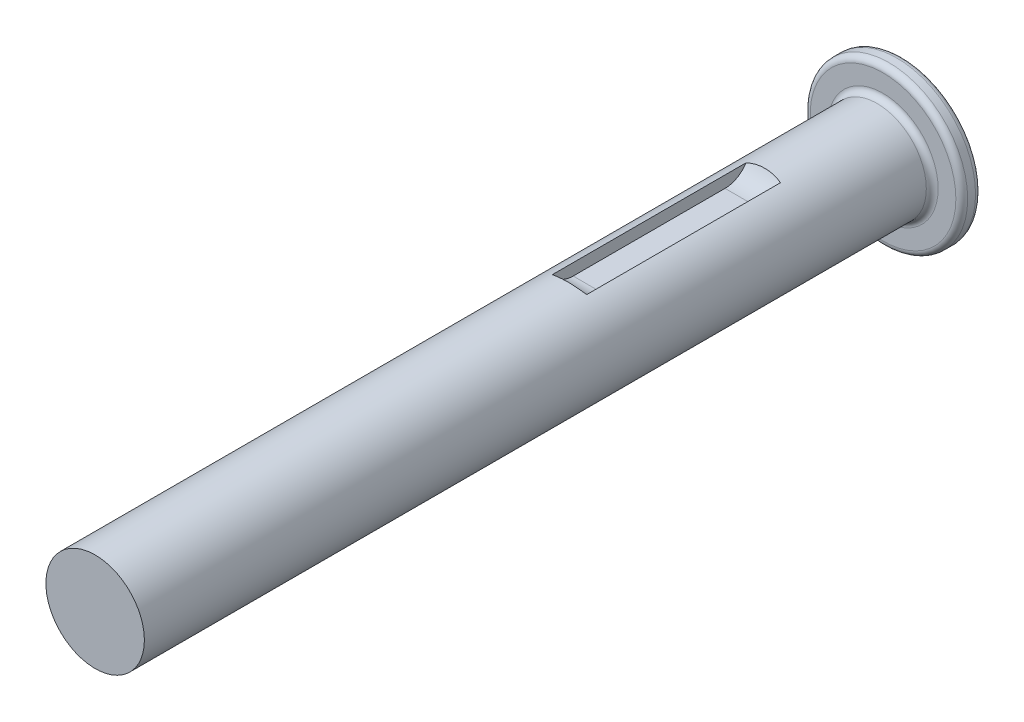
ISO-10303-21;
HEADER;
FILE_DESCRIPTION(('STEP AP214'),'2;1');
FILE_NAME('part.step','',(''),(''),'','','');
FILE_SCHEMA(('AUTOMOTIVE_DESIGN { 1 0 10303 214 1 1 1 1 }'));
ENDSEC;
DATA;
#1=APPLICATION_CONTEXT('core data for automotive mechanical design processes');
#2=APPLICATION_PROTOCOL_DEFINITION('international standard','automotive_design',2000,#1);
#3=PRODUCT_CONTEXT('',#1,'mechanical');
#4=PRODUCT('Part','Part','',(#3));
#5=PRODUCT_RELATED_PRODUCT_CATEGORY('part','',(#4));
#6=PRODUCT_DEFINITION_FORMATION('','',#4);
#7=PRODUCT_DEFINITION_CONTEXT('part definition',#1,'design');
#8=PRODUCT_DEFINITION('design','',#6,#7);
#9=PRODUCT_DEFINITION_SHAPE('','',#8);
#10=(LENGTH_UNIT() NAMED_UNIT(*) SI_UNIT(.MILLI.,.METRE.));
#11=(NAMED_UNIT(*) PLANE_ANGLE_UNIT() SI_UNIT($,.RADIAN.));
#12=(NAMED_UNIT(*) SI_UNIT($,.STERADIAN.) SOLID_ANGLE_UNIT());
#13=UNCERTAINTY_MEASURE_WITH_UNIT(LENGTH_MEASURE(1.E-05),#10,'distance_accuracy_value','');
#14=(GEOMETRIC_REPRESENTATION_CONTEXT(3) GLOBAL_UNCERTAINTY_ASSIGNED_CONTEXT((#13)) GLOBAL_UNIT_ASSIGNED_CONTEXT((#10,
#11,#12)) REPRESENTATION_CONTEXT('',''));
#15=CARTESIAN_POINT('',(0.,0.,0.));
#16=DIRECTION('',(0.,0.,1.));
#17=DIRECTION('',(1.,0.,0.));
#18=AXIS2_PLACEMENT_3D('',#15,#16,#17);
#19=CARTESIAN_POINT('',(0.,0.,2.));
#20=DIRECTION('',(0.,0.,-1.));
#21=DIRECTION('',(-1.,0.,0.));
#22=AXIS2_PLACEMENT_3D('',#19,#20,#21);
#23=CYLINDRICAL_SURFACE('',#22,8.);
#24=CARTESIAN_POINT('',(0.,0.,0.6));
#25=DIRECTION('',(0.,0.,1.));
#26=DIRECTION('',(1.,0.,0.));
#27=AXIS2_PLACEMENT_3D('',#24,#25,#26);
#28=CIRCLE('',#27,8.);
#29=CARTESIAN_POINT('',(8.,0.,0.6));
#30=VERTEX_POINT('',#29);
#31=EDGE_CURVE('E198',#30,#30,#28,.T.);
#32=ORIENTED_EDGE('',*,*,#31,.T.);
#33=EDGE_LOOP('',(#32));
#34=FACE_BOUND('',#33,.T.);
#35=CARTESIAN_POINT('',(0.,0.,1.4));
#36=DIRECTION('',(0.,0.,1.));
#37=DIRECTION('',(1.,0.,0.));
#38=AXIS2_PLACEMENT_3D('',#35,#36,#37);
#39=CIRCLE('',#38,8.);
#40=CARTESIAN_POINT('',(8.,0.,1.4));
#41=VERTEX_POINT('',#40);
#42=EDGE_CURVE('E185',#41,#41,#39,.F.);
#43=ORIENTED_EDGE('',*,*,#42,.T.);
#44=EDGE_LOOP('',(#43));
#45=FACE_BOUND('',#44,.T.);
#46=ADVANCED_FACE('F39',(#34,#45),#23,.T.);
#47=CARTESIAN_POINT('',(0.,0.,2.));
#48=DIRECTION('',(0.,0.,1.));
#49=DIRECTION('',(1.,0.,0.));
#50=AXIS2_PLACEMENT_3D('',#47,#48,#49);
#51=PLANE('',#50);
#52=CARTESIAN_POINT('',(0.,0.,2.));
#53=DIRECTION('',(0.,0.,1.));
#54=DIRECTION('',(1.,0.,0.));
#55=AXIS2_PLACEMENT_3D('',#52,#53,#54);
#56=CIRCLE('',#55,7.4);
#57=CARTESIAN_POINT('',(7.4,0.,2.));
#58=VERTEX_POINT('',#57);
#59=EDGE_CURVE('E48',#58,#58,#56,.T.);
#60=ORIENTED_EDGE('',*,*,#59,.T.);
#61=EDGE_LOOP('',(#60));
#62=FACE_BOUND('',#61,.T.);
#63=CARTESIAN_POINT('',(0.,0.,2.));
#64=DIRECTION('',(0.,0.,1.));
#65=DIRECTION('',(1.,0.,0.));
#66=AXIS2_PLACEMENT_3D('',#63,#64,#65);
#67=CIRCLE('',#66,5.6);
#68=CARTESIAN_POINT('',(5.6,0.,2.));
#69=VERTEX_POINT('',#68);
#70=EDGE_CURVE('E189',#69,#69,#67,.F.);
#71=ORIENTED_EDGE('',*,*,#70,.T.);
#72=EDGE_LOOP('',(#71));
#73=FACE_BOUND('',#72,.T.);
#74=ADVANCED_FACE('F161',(#62,#73),#51,.T.);
#75=CARTESIAN_POINT('',(0.,0.,0.));
#76=DIRECTION('',(0.,0.,1.));
#77=DIRECTION('',(1.,0.,0.));
#78=AXIS2_PLACEMENT_3D('',#75,#76,#77);
#79=PLANE('',#78);
#80=CARTESIAN_POINT('',(0.,0.,0.));
#81=DIRECTION('',(0.,0.,1.));
#82=DIRECTION('',(1.,0.,0.));
#83=AXIS2_PLACEMENT_3D('',#80,#81,#82);
#84=CIRCLE('',#83,7.4);
#85=CARTESIAN_POINT('',(7.4,0.,0.));
#86=VERTEX_POINT('',#85);
#87=EDGE_CURVE('E192',#86,#86,#84,.F.);
#88=ORIENTED_EDGE('',*,*,#87,.T.);
#89=EDGE_LOOP('',(#88));
#90=FACE_BOUND('',#89,.T.);
#91=ADVANCED_FACE('F158',(#90),#79,.F.);
#92=CARTESIAN_POINT('',(0.,0.,82.));
#93=DIRECTION('',(0.,0.,-1.));
#94=DIRECTION('',(-1.,0.,0.));
#95=AXIS2_PLACEMENT_3D('',#92,#93,#94);
#96=CYLINDRICAL_SURFACE('',#95,5.);
#97=CARTESIAN_POINT('',(0.,0.,2.6));
#98=DIRECTION('',(0.,0.,1.));
#99=DIRECTION('',(1.,0.,0.));
#100=AXIS2_PLACEMENT_3D('',#97,#98,#99);
#101=CIRCLE('',#100,5.);
#102=CARTESIAN_POINT('',(5.,0.,2.6));
#103=VERTEX_POINT('',#102);
#104=EDGE_CURVE('E11',#103,#103,#101,.T.);
#105=ORIENTED_EDGE('',*,*,#104,.T.);
#106=EDGE_LOOP('',(#105));
#107=FACE_BOUND('',#106,.T.);
#108=CARTESIAN_POINT('',(1.75,4.6837484987988,33.8341490453951));
#109=CARTESIAN_POINT('',(1.65310525377348,4.71997347523032,33.8565317749775));
#110=CARTESIAN_POINT('',(1.55451987280428,4.75336014091179,33.8759781321668));
#111=CARTESIAN_POINT('',(1.35472970092927,4.81409861289837,33.9098260798753));
#112=CARTESIAN_POINT('',(1.25352674862517,4.84145453317008,33.9242311133771));
#113=CARTESIAN_POINT('',(1.04903052159004,4.88984702739291,33.948864562172));
#114=CARTESIAN_POINT('',(0.945735330558365,4.91087749994882,33.9590889482942));
#115=CARTESIAN_POINT('',(0.73771866216196,4.94640319272054,33.9759402499853));
#116=CARTESIAN_POINT('',(0.632996858821068,4.96089689259868,33.9825663287246));
#117=CARTESIAN_POINT('',(0.410006986396611,4.98456968143063,33.9932453051912));
#118=CARTESIAN_POINT('',(0.291628271387543,4.99289708530749,33.9968915329534));
#119=CARTESIAN_POINT('',(0.0545210005485193,5.00111015312778,34.0004883439763));
#120=CARTESIAN_POINT('',(-0.0642075751470417,5.00099532809885,34.0004387131735));
#121=CARTESIAN_POINT('',(-0.301208808899781,4.99232598577529,33.9966406714984));
#122=CARTESIAN_POINT('',(-0.419481754092021,4.98377816926544,33.992895197312));
#123=CARTESIAN_POINT('',(-0.654890465995687,4.95834053495578,33.9814057326323));
#124=CARTESIAN_POINT('',(-0.772026502444622,4.94145274775897,33.9736627154337));
#125=CARTESIAN_POINT('',(-1.03616571710714,4.89376258407831,33.9508401669567));
#126=CARTESIAN_POINT('',(-1.18260916935279,4.86042244485262,33.934336362715));
#127=CARTESIAN_POINT('',(-1.39852434462111,4.80101141437203,33.9025489021799));
#128=CARTESIAN_POINT('',(-1.4698515751892,4.77964824781998,33.8907854103836));
#129=CARTESIAN_POINT('',(-1.6110706447214,4.73391671392214,33.8645693682042));
#130=CARTESIAN_POINT('',(-1.6809617714944,4.70954689557035,33.8501155177326));
#131=CARTESIAN_POINT('',(-1.75,4.6837484987988,33.8341490453951));
#132=B_SPLINE_CURVE_WITH_KNOTS('',3,(#108,#109,#110,#111,#112,#113,#114,#115,#116,#117,#118,
#119,#120,#121,#122,#123,#124,#125,#126,#127,#128,#129,#130,#131),.UNSPECIFIED.,.F.,.F.,(4,2,2,
2,2,2,2,2,2,2,2,4),(0.,0.317360320503886,0.634503474191964,0.951951563692612,1.26947344797507,
1.6252863599761,1.98111988061255,2.33667088643563,2.69213536590591,3.14446851234162,
3.37050823430955,3.59665747259952),.UNSPECIFIED.);
#133=CARTESIAN_POINT('',(1.75,4.6837484987988,33.8341490453951));
#134=VERTEX_POINT('',#133);
#135=CARTESIAN_POINT('',(-1.75,4.6837484987988,33.8341490453951));
#136=VERTEX_POINT('',#135);
#137=EDGE_CURVE('E62',#134,#136,#132,.T.);
#138=ORIENTED_EDGE('',*,*,#137,.T.);
#139=DIRECTION('',(0.,0.,-1.));
#140=VECTOR('',#139,1.);
#141=CARTESIAN_POINT('',(-1.75,4.6837484987988,82.));
#142=LINE('',#141,#140);
#143=CARTESIAN_POINT('',(-1.75,4.6837484987988,14.1658509546049));
#144=VERTEX_POINT('',#143);
#145=EDGE_CURVE('E88',#144,#136,#142,.F.);
#146=ORIENTED_EDGE('',*,*,#145,.F.);
#147=CARTESIAN_POINT('',(-1.75,4.6837484987988,14.1658509546049));
#148=CARTESIAN_POINT('',(-1.65310525377348,4.71997347523032,14.1434682250225));
#149=CARTESIAN_POINT('',(-1.55451987280428,4.75336014091179,14.1240218678332));
#150=CARTESIAN_POINT('',(-1.35472970092927,4.81409861289837,14.0901739201247));
#151=CARTESIAN_POINT('',(-1.25352674862517,4.84145453317008,14.0757688866229));
#152=CARTESIAN_POINT('',(-1.04903052159004,4.88984702739291,14.0511354378279));
#153=CARTESIAN_POINT('',(-0.945735330558364,4.91087749994882,14.0409110517058));
#154=CARTESIAN_POINT('',(-0.737718662161959,4.94640319272055,14.0240597500147));
#155=CARTESIAN_POINT('',(-0.632996858821066,4.96089689259868,14.0174336712754));
#156=CARTESIAN_POINT('',(-0.410006986396608,4.98456968143063,14.0067546948088));
#157=CARTESIAN_POINT('',(-0.291628271387539,4.99289708530749,14.0031084670466));
#158=CARTESIAN_POINT('',(-0.054521000548516,5.00111015312778,13.9995116560237));
#159=CARTESIAN_POINT('',(0.0642075751470451,5.00099532809885,13.9995612868265));
#160=CARTESIAN_POINT('',(0.301208808899785,4.99232598577529,14.0033593285016));
#161=CARTESIAN_POINT('',(0.419481754092025,4.98377816926544,14.007104802688));
#162=CARTESIAN_POINT('',(0.654890465995691,4.95834053495578,14.0185942673677));
#163=CARTESIAN_POINT('',(0.772026502444626,4.94145274775897,14.0263372845663));
#164=CARTESIAN_POINT('',(1.03616571710715,4.89376258407831,14.0491598330433));
#165=CARTESIAN_POINT('',(1.18260916935279,4.86042244485262,14.065663637285));
#166=CARTESIAN_POINT('',(1.39852434462111,4.80101141437203,14.0974510978201));
#167=CARTESIAN_POINT('',(1.4698515751892,4.77964824781998,14.1092145896164));
#168=CARTESIAN_POINT('',(1.6110706447214,4.73391671392214,14.1354306317958));
#169=CARTESIAN_POINT('',(1.6809617714944,4.70954689557035,14.1498844822674));
#170=CARTESIAN_POINT('',(1.75,4.6837484987988,14.1658509546049));
#171=B_SPLINE_CURVE_WITH_KNOTS('',3,(#147,#148,#149,#150,#151,#152,#153,#154,#155,#156,#157,
#158,#159,#160,#161,#162,#163,#164,#165,#166,#167,#168,#169,#170),.UNSPECIFIED.,.F.,.F.,(4,2,2,
2,2,2,2,2,2,2,2,4),(0.,0.317360320503887,0.634503474191965,0.951951563692614,1.26947344797507,
1.6252863599761,1.98111988061255,2.33667088643563,2.69213536590591,3.14446851234162,
3.37050823430955,3.59665747259952),.UNSPECIFIED.);
#172=CARTESIAN_POINT('',(1.75,4.6837484987988,14.1658509546049));
#173=VERTEX_POINT('',#172);
#174=EDGE_CURVE('E133',#144,#173,#171,.T.);
#175=ORIENTED_EDGE('',*,*,#174,.T.);
#176=DIRECTION('',(0.,0.,-1.));
#177=VECTOR('',#176,1.);
#178=CARTESIAN_POINT('',(1.75,4.6837484987988,82.));
#179=LINE('',#178,#177);
#180=EDGE_CURVE('E122',#173,#134,#179,.F.);
#181=ORIENTED_EDGE('',*,*,#180,.T.);
#182=EDGE_LOOP('',(#138,#146,#175,#181));
#183=FACE_BOUND('',#182,.T.);
#184=CARTESIAN_POINT('',(0.,0.,82.));
#185=DIRECTION('',(0.,0.,1.));
#186=DIRECTION('',(1.,0.,0.));
#187=AXIS2_PLACEMENT_3D('',#184,#185,#186);
#188=CIRCLE('',#187,5.);
#189=CARTESIAN_POINT('',(5.,0.,82.));
#190=VERTEX_POINT('',#189);
#191=EDGE_CURVE('E117',#190,#190,#188,.T.);
#192=ORIENTED_EDGE('',*,*,#191,.F.);
#193=EDGE_LOOP('',(#192));
#194=FACE_BOUND('',#193,.T.);
#195=ADVANCED_FACE('F140',(#107,#183,#194),#96,.T.);
#196=CARTESIAN_POINT('',(0.,0.,82.));
#197=DIRECTION('',(0.,0.,1.));
#198=DIRECTION('',(1.,0.,0.));
#199=AXIS2_PLACEMENT_3D('',#196,#197,#198);
#200=PLANE('',#199);
#201=ORIENTED_EDGE('',*,*,#191,.T.);
#202=EDGE_LOOP('',(#201));
#203=FACE_BOUND('',#202,.T.);
#204=ADVANCED_FACE('F151',(#203),#200,.T.);
#205=CARTESIAN_POINT('',(-1.75,6.,16.2912878474779));
#206=DIRECTION('',(1.,0.,0.));
#207=DIRECTION('',(0.,0.,-1.));
#208=AXIS2_PLACEMENT_3D('',#205,#206,#207);
#209=CYLINDRICAL_SURFACE('',#208,2.5);
#210=CARTESIAN_POINT('',(-1.75,6.,16.2912878474779));
#211=DIRECTION('',(1.,0.,0.));
#212=DIRECTION('',(0.,0.,-1.));
#213=AXIS2_PLACEMENT_3D('',#210,#211,#212);
#214=CIRCLE('',#213,2.5);
#215=CARTESIAN_POINT('',(-1.75,3.5,16.2912878474779));
#216=VERTEX_POINT('',#215);
#217=EDGE_CURVE('E91',#216,#144,#214,.T.);
#218=ORIENTED_EDGE('',*,*,#217,.F.);
#219=DIRECTION('',(1.,0.,0.));
#220=VECTOR('',#219,1.);
#221=CARTESIAN_POINT('',(-1.75,3.5,16.2912878474779));
#222=LINE('',#221,#220);
#223=CARTESIAN_POINT('',(1.75,3.5,16.2912878474779));
#224=VERTEX_POINT('',#223);
#225=EDGE_CURVE('E99',#216,#224,#222,.T.);
#226=ORIENTED_EDGE('',*,*,#225,.T.);
#227=CARTESIAN_POINT('',(1.75,6.,16.2912878474779));
#228=DIRECTION('',(1.,0.,0.));
#229=DIRECTION('',(0.,0.,-1.));
#230=AXIS2_PLACEMENT_3D('',#227,#228,#229);
#231=CIRCLE('',#230,2.5);
#232=EDGE_CURVE('E107',#224,#173,#231,.T.);
#233=ORIENTED_EDGE('',*,*,#232,.T.);
#234=ORIENTED_EDGE('',*,*,#174,.F.);
#235=EDGE_LOOP('',(#218,#226,#233,#234));
#236=FACE_BOUND('',#235,.T.);
#237=ADVANCED_FACE('F147',(#236),#209,.F.);
#238=CARTESIAN_POINT('',(-1.75,6.,31.7087121525221));
#239=DIRECTION('',(1.,0.,0.));
#240=DIRECTION('',(0.,0.,-1.));
#241=AXIS2_PLACEMENT_3D('',#238,#239,#240);
#242=CYLINDRICAL_SURFACE('',#241,2.5);
#243=CARTESIAN_POINT('',(1.75,6.,31.7087121525221));
#244=DIRECTION('',(1.,0.,0.));
#245=DIRECTION('',(0.,0.,-1.));
#246=AXIS2_PLACEMENT_3D('',#243,#244,#245);
#247=CIRCLE('',#246,2.5);
#248=CARTESIAN_POINT('',(1.75,3.5,31.7087121525221));
#249=VERTEX_POINT('',#248);
#250=EDGE_CURVE('E55',#134,#249,#247,.T.);
#251=ORIENTED_EDGE('',*,*,#250,.T.);
#252=DIRECTION('',(1.,0.,0.));
#253=VECTOR('',#252,1.);
#254=CARTESIAN_POINT('',(-1.75,3.5,31.7087121525221));
#255=LINE('',#254,#253);
#256=CARTESIAN_POINT('',(-1.75,3.5,31.7087121525221));
#257=VERTEX_POINT('',#256);
#258=EDGE_CURVE('E94',#257,#249,#255,.T.);
#259=ORIENTED_EDGE('',*,*,#258,.F.);
#260=CARTESIAN_POINT('',(-1.75,6.,31.7087121525221));
#261=DIRECTION('',(1.,0.,0.));
#262=DIRECTION('',(0.,0.,-1.));
#263=AXIS2_PLACEMENT_3D('',#260,#261,#262);
#264=CIRCLE('',#263,2.5);
#265=EDGE_CURVE('E82',#136,#257,#264,.T.);
#266=ORIENTED_EDGE('',*,*,#265,.F.);
#267=ORIENTED_EDGE('',*,*,#137,.F.);
#268=EDGE_LOOP('',(#251,#259,#266,#267));
#269=FACE_BOUND('',#268,.T.);
#270=ADVANCED_FACE('F95',(#269),#242,.F.);
#271=CARTESIAN_POINT('',(-1.75,6.,16.2912878474779));
#272=DIRECTION('',(1.,0.,0.));
#273=DIRECTION('',(0.,0.,-1.));
#274=AXIS2_PLACEMENT_3D('',#271,#272,#273);
#275=PLANE('',#274);
#276=ORIENTED_EDGE('',*,*,#145,.T.);
#277=ORIENTED_EDGE('',*,*,#265,.T.);
#278=DIRECTION('',(0.,0.,-1.));
#279=VECTOR('',#278,1.);
#280=CARTESIAN_POINT('',(-1.75,3.5,31.7087121525221));
#281=LINE('',#280,#279);
#282=EDGE_CURVE('E87',#257,#216,#281,.T.);
#283=ORIENTED_EDGE('',*,*,#282,.T.);
#284=ORIENTED_EDGE('',*,*,#217,.T.);
#285=EDGE_LOOP('',(#276,#277,#283,#284));
#286=FACE_BOUND('',#285,.T.);
#287=ADVANCED_FACE('F84',(#286),#275,.T.);
#288=CARTESIAN_POINT('',(1.75,6.,16.2912878474779));
#289=DIRECTION('',(1.,0.,0.));
#290=DIRECTION('',(0.,0.,-1.));
#291=AXIS2_PLACEMENT_3D('',#288,#289,#290);
#292=PLANE('',#291);
#293=ORIENTED_EDGE('',*,*,#232,.F.);
#294=DIRECTION('',(0.,0.,-1.));
#295=VECTOR('',#294,1.);
#296=CARTESIAN_POINT('',(1.75,3.5,31.7087121525221));
#297=LINE('',#296,#295);
#298=EDGE_CURVE('E113',#249,#224,#297,.T.);
#299=ORIENTED_EDGE('',*,*,#298,.F.);
#300=ORIENTED_EDGE('',*,*,#250,.F.);
#301=ORIENTED_EDGE('',*,*,#180,.F.);
#302=EDGE_LOOP('',(#293,#299,#300,#301));
#303=FACE_BOUND('',#302,.T.);
#304=ADVANCED_FACE('F208',(#303),#292,.F.);
#305=CARTESIAN_POINT('',(-1.75,3.5,31.7087121525221));
#306=DIRECTION('',(0.,-1.,0.));
#307=DIRECTION('',(0.,0.,-1.));
#308=AXIS2_PLACEMENT_3D('',#305,#306,#307);
#309=PLANE('',#308);
#310=ORIENTED_EDGE('',*,*,#298,.T.);
#311=ORIENTED_EDGE('',*,*,#225,.F.);
#312=ORIENTED_EDGE('',*,*,#282,.F.);
#313=ORIENTED_EDGE('',*,*,#258,.T.);
#314=EDGE_LOOP('',(#310,#311,#312,#313));
#315=FACE_BOUND('',#314,.T.);
#316=ADVANCED_FACE('F101',(#315),#309,.F.);
#317=CARTESIAN_POINT('',(0.,0.,0.6));
#318=DIRECTION('',(0.,0.,1.));
#319=DIRECTION('',(1.,0.,0.));
#320=AXIS2_PLACEMENT_3D('',#317,#318,#319);
#321=TOROIDAL_SURFACE('',#320,7.4,0.6);
#322=ORIENTED_EDGE('',*,*,#87,.F.);
#323=EDGE_LOOP('',(#322));
#324=FACE_BOUND('',#323,.T.);
#325=ORIENTED_EDGE('',*,*,#31,.F.);
#326=EDGE_LOOP('',(#325));
#327=FACE_BOUND('',#326,.T.);
#328=ADVANCED_FACE('F172',(#324,#327),#321,.T.);
#329=CARTESIAN_POINT('',(0.,0.,1.4));
#330=DIRECTION('',(0.,0.,1.));
#331=DIRECTION('',(1.,0.,0.));
#332=AXIS2_PLACEMENT_3D('',#329,#330,#331);
#333=TOROIDAL_SURFACE('',#332,7.4,0.6);
#334=ORIENTED_EDGE('',*,*,#42,.F.);
#335=EDGE_LOOP('',(#334));
#336=FACE_BOUND('',#335,.T.);
#337=ORIENTED_EDGE('',*,*,#59,.F.);
#338=EDGE_LOOP('',(#337));
#339=FACE_BOUND('',#338,.T.);
#340=ADVANCED_FACE('F174',(#336,#339),#333,.T.);
#341=CARTESIAN_POINT('',(0.,0.,2.6));
#342=DIRECTION('',(0.,0.,1.));
#343=DIRECTION('',(1.,0.,0.));
#344=AXIS2_PLACEMENT_3D('',#341,#342,#343);
#345=TOROIDAL_SURFACE('',#344,5.6,0.6);
#346=ORIENTED_EDGE('',*,*,#70,.F.);
#347=EDGE_LOOP('',(#346));
#348=FACE_BOUND('',#347,.T.);
#349=ORIENTED_EDGE('',*,*,#104,.F.);
#350=EDGE_LOOP('',(#349));
#351=FACE_BOUND('',#350,.T.);
#352=ADVANCED_FACE('F41',(#348,#351),#345,.F.);
#353=CLOSED_SHELL('',(#46,#74,#91,#195,#204,#237,#270,#287,#304,#316,#328,#340,#352));
#354=MANIFOLD_SOLID_BREP('B2',#353);
#355=ADVANCED_BREP_SHAPE_REPRESENTATION('',(#18,#354),#14);
#356=SHAPE_DEFINITION_REPRESENTATION(#9,#355);
ENDSEC;
END-ISO-10303-21;
